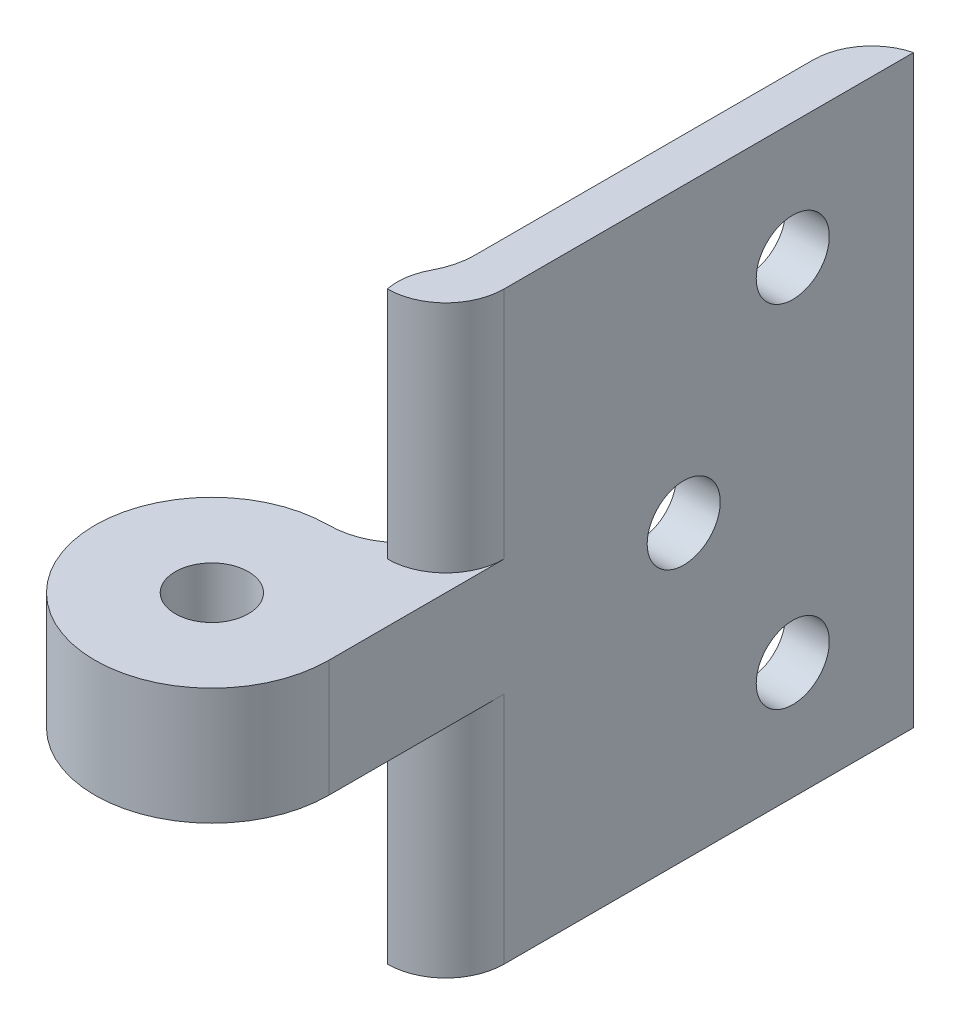
ISO-10303-21;
HEADER;
FILE_DESCRIPTION(('STEP AP214'),'2;1');
FILE_NAME('part.step','',(''),(''),'','','');
FILE_SCHEMA(('AUTOMOTIVE_DESIGN { 1 0 10303 214 1 1 1 1 }'));
ENDSEC;
DATA;
#1=APPLICATION_CONTEXT('core data for automotive mechanical design processes');
#2=APPLICATION_PROTOCOL_DEFINITION('international standard','automotive_design',2000,#1);
#3=PRODUCT_CONTEXT('',#1,'mechanical');
#4=PRODUCT('Part','Part','',(#3));
#5=PRODUCT_RELATED_PRODUCT_CATEGORY('part','',(#4));
#6=PRODUCT_DEFINITION_FORMATION('','',#4);
#7=PRODUCT_DEFINITION_CONTEXT('part definition',#1,'design');
#8=PRODUCT_DEFINITION('design','',#6,#7);
#9=PRODUCT_DEFINITION_SHAPE('','',#8);
#10=(LENGTH_UNIT() NAMED_UNIT(*) SI_UNIT(.MILLI.,.METRE.));
#11=(NAMED_UNIT(*) PLANE_ANGLE_UNIT() SI_UNIT($,.RADIAN.));
#12=(NAMED_UNIT(*) SI_UNIT($,.STERADIAN.) SOLID_ANGLE_UNIT());
#13=UNCERTAINTY_MEASURE_WITH_UNIT(LENGTH_MEASURE(1.E-05),#10,'distance_accuracy_value','');
#14=(GEOMETRIC_REPRESENTATION_CONTEXT(3) GLOBAL_UNCERTAINTY_ASSIGNED_CONTEXT((#13)) GLOBAL_UNIT_ASSIGNED_CONTEXT((#10,
#11,#12)) REPRESENTATION_CONTEXT('',''));
#15=CARTESIAN_POINT('',(0.,0.,0.));
#16=DIRECTION('',(0.,0.,1.));
#17=DIRECTION('',(1.,0.,0.));
#18=AXIS2_PLACEMENT_3D('',#15,#16,#17);
#19=CARTESIAN_POINT('',(0.,20.,0.));
#20=DIRECTION('',(0.,1.,0.));
#21=DIRECTION('',(0.,0.,1.));
#22=AXIS2_PLACEMENT_3D('',#19,#20,#21);
#23=PLANE('',#22);
#24=DIRECTION('',(0.,0.,-1.));
#25=VECTOR('',#24,1.);
#26=CARTESIAN_POINT('',(4.,20.,0.));
#27=LINE('',#26,#25);
#28=CARTESIAN_POINT('',(4.,20.,-6.));
#29=VERTEX_POINT('',#28);
#30=CARTESIAN_POINT('',(4.,20.,-20.));
#31=VERTEX_POINT('',#30);
#32=EDGE_CURVE('E222',#29,#31,#27,.T.);
#33=ORIENTED_EDGE('',*,*,#32,.T.);
#34=CARTESIAN_POINT('',(4.5,20.,-18.0635083268963));
#35=DIRECTION('',(0.,1.,0.));
#36=DIRECTION('',(0.,0.,1.));
#37=AXIS2_PLACEMENT_3D('',#34,#35,#36);
#38=CIRCLE('',#37,2.);
#39=CARTESIAN_POINT('',(2.5,20.,-18.0635083268963));
#40=VERTEX_POINT('',#39);
#41=EDGE_CURVE('E11',#31,#40,#38,.T.);
#42=ORIENTED_EDGE('',*,*,#41,.T.);
#43=DIRECTION('',(0.,0.,1.));
#44=VECTOR('',#43,1.);
#45=CARTESIAN_POINT('',(2.5,20.,-15.1200276625702));
#46=LINE('',#45,#44);
#47=CARTESIAN_POINT('',(2.5,20.,-6.5));
#48=VERTEX_POINT('',#47);
#49=EDGE_CURVE('E218',#40,#48,#46,.T.);
#50=ORIENTED_EDGE('',*,*,#49,.T.);
#51=CARTESIAN_POINT('',(0.,20.,-6.5));
#52=DIRECTION('',(0.,-1.,0.));
#53=DIRECTION('',(0.,0.,-1.));
#54=AXIS2_PLACEMENT_3D('',#51,#52,#53);
#55=CIRCLE('',#54,2.5);
#56=CARTESIAN_POINT('',(2.20282577906401,20.,-5.31781617880676));
#57=VERTEX_POINT('',#56);
#58=EDGE_CURVE('E221',#48,#57,#55,.T.);
#59=ORIENTED_EDGE('',*,*,#58,.T.);
#60=CARTESIAN_POINT('',(3.96508640231522,20.,-4.37206912185217));
#61=DIRECTION('',(0.,1.,0.));
#62=DIRECTION('',(0.,0.,1.));
#63=AXIS2_PLACEMENT_3D('',#60,#61,#62);
#64=CIRCLE('',#63,2.);
#65=CARTESIAN_POINT('',(2.,20.,-4.));
#66=VERTEX_POINT('',#65);
#67=EDGE_CURVE('E178',#57,#66,#64,.T.);
#68=ORIENTED_EDGE('',*,*,#67,.T.);
#69=CARTESIAN_POINT('',(2.,20.,-6.));
#70=DIRECTION('',(0.,1.,0.));
#71=DIRECTION('',(0.,0.,1.));
#72=AXIS2_PLACEMENT_3D('',#69,#70,#71);
#73=CIRCLE('',#72,2.);
#74=EDGE_CURVE('E150',#66,#29,#73,.T.);
#75=ORIENTED_EDGE('',*,*,#74,.T.);
#76=EDGE_LOOP('',(#33,#42,#50,#59,#68,#75));
#77=FACE_BOUND('',#76,.T.);
#78=ADVANCED_FACE('F37',(#77),#23,.T.);
#79=CARTESIAN_POINT('',(0.,0.,0.));
#80=DIRECTION('',(0.,1.,0.));
#81=DIRECTION('',(0.,0.,1.));
#82=AXIS2_PLACEMENT_3D('',#79,#80,#81);
#83=PLANE('',#82);
#84=DIRECTION('',(0.,0.,1.));
#85=VECTOR('',#84,1.);
#86=CARTESIAN_POINT('',(2.5,0.,-6.5));
#87=LINE('',#86,#85);
#88=CARTESIAN_POINT('',(2.5,0.,-18.0635083268963));
#89=VERTEX_POINT('',#88);
#90=CARTESIAN_POINT('',(2.5,0.,-6.5));
#91=VERTEX_POINT('',#90);
#92=EDGE_CURVE('E210',#89,#91,#87,.T.);
#93=ORIENTED_EDGE('',*,*,#92,.F.);
#94=CARTESIAN_POINT('',(4.5,0.,-18.0635083268963));
#95=DIRECTION('',(0.,1.,0.));
#96=DIRECTION('',(0.,0.,1.));
#97=AXIS2_PLACEMENT_3D('',#94,#95,#96);
#98=CIRCLE('',#97,2.);
#99=CARTESIAN_POINT('',(4.,0.,-20.));
#100=VERTEX_POINT('',#99);
#101=EDGE_CURVE('E45',#89,#100,#98,.F.);
#102=ORIENTED_EDGE('',*,*,#101,.T.);
#103=DIRECTION('',(0.,0.,-1.));
#104=VECTOR('',#103,1.);
#105=CARTESIAN_POINT('',(4.,0.,0.));
#106=LINE('',#105,#104);
#107=CARTESIAN_POINT('',(4.,0.,-6.));
#108=VERTEX_POINT('',#107);
#109=EDGE_CURVE('E166',#108,#100,#106,.T.);
#110=ORIENTED_EDGE('',*,*,#109,.F.);
#111=CARTESIAN_POINT('',(2.,0.,-6.));
#112=DIRECTION('',(0.,1.,0.));
#113=DIRECTION('',(0.,0.,1.));
#114=AXIS2_PLACEMENT_3D('',#111,#112,#113);
#115=CIRCLE('',#114,2.);
#116=CARTESIAN_POINT('',(2.,0.,-4.));
#117=VERTEX_POINT('',#116);
#118=EDGE_CURVE('E187',#108,#117,#115,.F.);
#119=ORIENTED_EDGE('',*,*,#118,.T.);
#120=CARTESIAN_POINT('',(3.96508640231522,0.,-4.37206912185217));
#121=DIRECTION('',(0.,1.,0.));
#122=DIRECTION('',(0.,0.,1.));
#123=AXIS2_PLACEMENT_3D('',#120,#121,#122);
#124=CIRCLE('',#123,2.);
#125=CARTESIAN_POINT('',(2.20282577906401,0.,-5.31781617880676));
#126=VERTEX_POINT('',#125);
#127=EDGE_CURVE('E193',#117,#126,#124,.F.);
#128=ORIENTED_EDGE('',*,*,#127,.T.);
#129=CARTESIAN_POINT('',(0.,0.,-6.5));
#130=DIRECTION('',(0.,-1.,0.));
#131=DIRECTION('',(0.,0.,-1.));
#132=AXIS2_PLACEMENT_3D('',#129,#130,#131);
#133=CIRCLE('',#132,2.5);
#134=EDGE_CURVE('E226',#91,#126,#133,.T.);
#135=ORIENTED_EDGE('',*,*,#134,.F.);
#136=EDGE_LOOP('',(#93,#102,#110,#119,#128,#135));
#137=FACE_BOUND('',#136,.T.);
#138=ADVANCED_FACE('F207',(#137),#83,.F.);
#139=CARTESIAN_POINT('',(0.,20.,0.));
#140=DIRECTION('',(0.,-1.,0.));
#141=DIRECTION('',(0.,0.,-1.));
#142=AXIS2_PLACEMENT_3D('',#139,#140,#141);
#143=CYLINDRICAL_SURFACE('',#142,4.);
#144=DIRECTION('',(0.,-1.,0.));
#145=VECTOR('',#144,1.);
#146=CARTESIAN_POINT('',(0.,20.,-4.));
#147=LINE('',#146,#145);
#148=CARTESIAN_POINT('',(0.,12.,-4.));
#149=VERTEX_POINT('',#148);
#150=CARTESIAN_POINT('',(0.,8.,-4.));
#151=VERTEX_POINT('',#150);
#152=EDGE_CURVE('E224',#149,#151,#147,.T.);
#153=ORIENTED_EDGE('',*,*,#152,.T.);
#154=CARTESIAN_POINT('',(0.,8.,0.));
#155=DIRECTION('',(0.,1.,0.));
#156=DIRECTION('',(0.,0.,1.));
#157=AXIS2_PLACEMENT_3D('',#154,#155,#156);
#158=CIRCLE('',#157,4.);
#159=CARTESIAN_POINT('',(4.,8.,0.));
#160=VERTEX_POINT('',#159);
#161=EDGE_CURVE('E144',#151,#160,#158,.T.);
#162=ORIENTED_EDGE('',*,*,#161,.T.);
#163=DIRECTION('',(0.,-1.,0.));
#164=VECTOR('',#163,1.);
#165=CARTESIAN_POINT('',(4.,20.,0.));
#166=LINE('',#165,#164);
#167=CARTESIAN_POINT('',(4.,12.,0.));
#168=VERTEX_POINT('',#167);
#169=EDGE_CURVE('E135',#168,#160,#166,.T.);
#170=ORIENTED_EDGE('',*,*,#169,.F.);
#171=CARTESIAN_POINT('',(0.,12.,0.));
#172=DIRECTION('',(0.,-1.,0.));
#173=DIRECTION('',(0.,0.,-1.));
#174=AXIS2_PLACEMENT_3D('',#171,#172,#173);
#175=CIRCLE('',#174,4.);
#176=EDGE_CURVE('E117',#168,#149,#175,.T.);
#177=ORIENTED_EDGE('',*,*,#176,.T.);
#178=EDGE_LOOP('',(#153,#162,#170,#177));
#179=FACE_BOUND('',#178,.T.);
#180=ADVANCED_FACE('F142',(#179),#143,.T.);
#181=CARTESIAN_POINT('',(4.,20.,0.));
#182=DIRECTION('',(-1.,0.,0.));
#183=DIRECTION('',(0.,0.,1.));
#184=AXIS2_PLACEMENT_3D('',#181,#182,#183);
#185=PLANE('',#184);
#186=CARTESIAN_POINT('',(4.,10.,-12.1392364547432));
#187=DIRECTION('',(-1.,0.,0.));
#188=DIRECTION('',(0.,0.,1.));
#189=AXIS2_PLACEMENT_3D('',#186,#187,#188);
#190=CIRCLE('',#189,1.25);
#191=CARTESIAN_POINT('',(4.,10.,-10.8892364547432));
#192=VERTEX_POINT('',#191);
#193=EDGE_CURVE('E160',#192,#192,#190,.T.);
#194=ORIENTED_EDGE('',*,*,#193,.T.);
#195=EDGE_LOOP('',(#194));
#196=FACE_BOUND('',#195,.T.);
#197=CARTESIAN_POINT('',(4.,4.,-15.8687376200159));
#198=DIRECTION('',(-1.,0.,0.));
#199=DIRECTION('',(0.,0.,1.));
#200=AXIS2_PLACEMENT_3D('',#197,#198,#199);
#201=CIRCLE('',#200,1.25);
#202=CARTESIAN_POINT('',(4.,4.,-14.6187376200159));
#203=VERTEX_POINT('',#202);
#204=EDGE_CURVE('E245',#203,#203,#201,.T.);
#205=ORIENTED_EDGE('',*,*,#204,.T.);
#206=EDGE_LOOP('',(#205));
#207=FACE_BOUND('',#206,.T.);
#208=CARTESIAN_POINT('',(4.,16.,-15.8687376200159));
#209=DIRECTION('',(-1.,0.,0.));
#210=DIRECTION('',(0.,0.,1.));
#211=AXIS2_PLACEMENT_3D('',#208,#209,#210);
#212=CIRCLE('',#211,1.25);
#213=CARTESIAN_POINT('',(4.,16.,-14.6187376200159));
#214=VERTEX_POINT('',#213);
#215=EDGE_CURVE('E242',#214,#214,#212,.T.);
#216=ORIENTED_EDGE('',*,*,#215,.T.);
#217=EDGE_LOOP('',(#216));
#218=FACE_BOUND('',#217,.T.);
#219=DIRECTION('',(0.,0.,1.));
#220=VECTOR('',#219,1.);
#221=CARTESIAN_POINT('',(4.,8.,6.));
#222=LINE('',#221,#220);
#223=CARTESIAN_POINT('',(4.,8.,-6.));
#224=VERTEX_POINT('',#223);
#225=EDGE_CURVE('E140',#224,#160,#222,.T.);
#226=ORIENTED_EDGE('',*,*,#225,.F.);
#227=DIRECTION('',(0.,1.,0.));
#228=VECTOR('',#227,1.);
#229=CARTESIAN_POINT('',(4.,20.,-6.));
#230=LINE('',#229,#228);
#231=EDGE_CURVE('E185',#224,#108,#230,.F.);
#232=ORIENTED_EDGE('',*,*,#231,.T.);
#233=ORIENTED_EDGE('',*,*,#109,.T.);
#234=DIRECTION('',(0.,-1.,0.));
#235=VECTOR('',#234,1.);
#236=CARTESIAN_POINT('',(4.,20.,-20.));
#237=LINE('',#236,#235);
#238=EDGE_CURVE('E147',#31,#100,#237,.T.);
#239=ORIENTED_EDGE('',*,*,#238,.F.);
#240=ORIENTED_EDGE('',*,*,#32,.F.);
#241=DIRECTION('',(0.,1.,0.));
#242=VECTOR('',#241,1.);
#243=CARTESIAN_POINT('',(4.,20.,-6.));
#244=LINE('',#243,#242);
#245=CARTESIAN_POINT('',(4.,12.,-6.));
#246=VERTEX_POINT('',#245);
#247=EDGE_CURVE('E138',#29,#246,#244,.F.);
#248=ORIENTED_EDGE('',*,*,#247,.T.);
#249=DIRECTION('',(0.,0.,-1.));
#250=VECTOR('',#249,1.);
#251=CARTESIAN_POINT('',(4.,12.,-4.));
#252=LINE('',#251,#250);
#253=EDGE_CURVE('E121',#168,#246,#252,.T.);
#254=ORIENTED_EDGE('',*,*,#253,.F.);
#255=ORIENTED_EDGE('',*,*,#169,.T.);
#256=EDGE_LOOP('',(#226,#232,#233,#239,#240,#248,#254,#255));
#257=FACE_BOUND('',#256,.T.);
#258=ADVANCED_FACE('F134',(#196,#207,#218,#257),#185,.F.);
#259=CARTESIAN_POINT('',(2.5,20.,-6.5));
#260=DIRECTION('',(1.,0.,0.));
#261=DIRECTION('',(0.,0.,-1.));
#262=AXIS2_PLACEMENT_3D('',#259,#260,#261);
#263=PLANE('',#262);
#264=CARTESIAN_POINT('',(2.5,10.,-12.1392364547432));
#265=DIRECTION('',(1.,0.,0.));
#266=DIRECTION('',(0.,0.,-1.));
#267=AXIS2_PLACEMENT_3D('',#264,#265,#266);
#268=CIRCLE('',#267,1.25);
#269=CARTESIAN_POINT('',(2.5,10.,-13.3892364547432));
#270=VERTEX_POINT('',#269);
#271=EDGE_CURVE('E163',#270,#270,#268,.T.);
#272=ORIENTED_EDGE('',*,*,#271,.T.);
#273=EDGE_LOOP('',(#272));
#274=FACE_BOUND('',#273,.T.);
#275=CARTESIAN_POINT('',(2.5,4.,-15.8687376200159));
#276=DIRECTION('',(1.,0.,0.));
#277=DIRECTION('',(0.,0.,-1.));
#278=AXIS2_PLACEMENT_3D('',#275,#276,#277);
#279=CIRCLE('',#278,1.25);
#280=CARTESIAN_POINT('',(2.5,4.,-17.1187376200159));
#281=VERTEX_POINT('',#280);
#282=EDGE_CURVE('E159',#281,#281,#279,.T.);
#283=ORIENTED_EDGE('',*,*,#282,.T.);
#284=EDGE_LOOP('',(#283));
#285=FACE_BOUND('',#284,.T.);
#286=CARTESIAN_POINT('',(2.5,16.,-15.8687376200159));
#287=DIRECTION('',(1.,0.,0.));
#288=DIRECTION('',(0.,0.,-1.));
#289=AXIS2_PLACEMENT_3D('',#286,#287,#288);
#290=CIRCLE('',#289,1.25);
#291=CARTESIAN_POINT('',(2.5,16.,-17.1187376200159));
#292=VERTEX_POINT('',#291);
#293=EDGE_CURVE('E156',#292,#292,#290,.T.);
#294=ORIENTED_EDGE('',*,*,#293,.T.);
#295=EDGE_LOOP('',(#294));
#296=FACE_BOUND('',#295,.T.);
#297=ORIENTED_EDGE('',*,*,#49,.F.);
#298=DIRECTION('',(0.,-1.,0.));
#299=VECTOR('',#298,1.);
#300=CARTESIAN_POINT('',(2.5,20.,-18.0635083268963));
#301=LINE('',#300,#299);
#302=EDGE_CURVE('E202',#40,#89,#301,.T.);
#303=ORIENTED_EDGE('',*,*,#302,.T.);
#304=ORIENTED_EDGE('',*,*,#92,.T.);
#305=DIRECTION('',(0.,-1.,0.));
#306=VECTOR('',#305,1.);
#307=CARTESIAN_POINT('',(2.5,20.,-6.5));
#308=LINE('',#307,#306);
#309=EDGE_CURVE('E152',#48,#91,#308,.T.);
#310=ORIENTED_EDGE('',*,*,#309,.F.);
#311=EDGE_LOOP('',(#297,#303,#304,#310));
#312=FACE_BOUND('',#311,.T.);
#313=ADVANCED_FACE('F215',(#274,#285,#296,#312),#263,.F.);
#314=CARTESIAN_POINT('',(0.,20.,-6.5));
#315=DIRECTION('',(0.,-1.,0.));
#316=DIRECTION('',(0.,0.,-1.));
#317=AXIS2_PLACEMENT_3D('',#314,#315,#316);
#318=CYLINDRICAL_SURFACE('',#317,2.5);
#319=ORIENTED_EDGE('',*,*,#134,.T.);
#320=DIRECTION('',(0.,-1.,0.));
#321=VECTOR('',#320,1.);
#322=CARTESIAN_POINT('',(2.20282577906401,20.,-5.31781617880676));
#323=LINE('',#322,#321);
#324=CARTESIAN_POINT('',(2.20282577906401,8.,-5.31781617880676));
#325=VERTEX_POINT('',#324);
#326=EDGE_CURVE('E197',#126,#325,#323,.F.);
#327=ORIENTED_EDGE('',*,*,#326,.T.);
#328=CARTESIAN_POINT('',(0.,8.,-6.5));
#329=DIRECTION('',(0.,1.,0.));
#330=DIRECTION('',(0.,0.,1.));
#331=AXIS2_PLACEMENT_3D('',#328,#329,#330);
#332=CIRCLE('',#331,2.5);
#333=EDGE_CURVE('E195',#325,#151,#332,.F.);
#334=ORIENTED_EDGE('',*,*,#333,.T.);
#335=ORIENTED_EDGE('',*,*,#152,.F.);
#336=CARTESIAN_POINT('',(0.,12.,-6.5));
#337=DIRECTION('',(0.,-1.,0.));
#338=DIRECTION('',(0.,0.,-1.));
#339=AXIS2_PLACEMENT_3D('',#336,#337,#338);
#340=CIRCLE('',#339,2.5);
#341=CARTESIAN_POINT('',(2.20282577906401,12.,-5.31781617880676));
#342=VERTEX_POINT('',#341);
#343=EDGE_CURVE('E124',#149,#342,#340,.F.);
#344=ORIENTED_EDGE('',*,*,#343,.T.);
#345=DIRECTION('',(0.,-1.,0.));
#346=VECTOR('',#345,1.);
#347=CARTESIAN_POINT('',(2.20282577906401,20.,-5.31781617880676));
#348=LINE('',#347,#346);
#349=EDGE_CURVE('E175',#342,#57,#348,.F.);
#350=ORIENTED_EDGE('',*,*,#349,.T.);
#351=ORIENTED_EDGE('',*,*,#58,.F.);
#352=ORIENTED_EDGE('',*,*,#309,.T.);
#353=EDGE_LOOP('',(#319,#327,#334,#335,#344,#350,#351,#352));
#354=FACE_BOUND('',#353,.T.);
#355=ADVANCED_FACE('F234',(#354),#318,.F.);
#356=CARTESIAN_POINT('',(4.,16.,-15.8687376200159));
#357=DIRECTION('',(-1.,0.,0.));
#358=DIRECTION('',(0.,0.,1.));
#359=AXIS2_PLACEMENT_3D('',#356,#357,#358);
#360=CYLINDRICAL_SURFACE('',#359,1.25);
#361=ORIENTED_EDGE('',*,*,#215,.F.);
#362=EDGE_LOOP('',(#361));
#363=FACE_BOUND('',#362,.T.);
#364=ORIENTED_EDGE('',*,*,#293,.F.);
#365=EDGE_LOOP('',(#364));
#366=FACE_BOUND('',#365,.T.);
#367=ADVANCED_FACE('F258',(#363,#366),#360,.F.);
#368=CARTESIAN_POINT('',(4.,4.,-15.8687376200159));
#369=DIRECTION('',(-1.,0.,0.));
#370=DIRECTION('',(0.,0.,1.));
#371=AXIS2_PLACEMENT_3D('',#368,#369,#370);
#372=CYLINDRICAL_SURFACE('',#371,1.25);
#373=ORIENTED_EDGE('',*,*,#204,.F.);
#374=EDGE_LOOP('',(#373));
#375=FACE_BOUND('',#374,.T.);
#376=ORIENTED_EDGE('',*,*,#282,.F.);
#377=EDGE_LOOP('',(#376));
#378=FACE_BOUND('',#377,.T.);
#379=ADVANCED_FACE('F254',(#375,#378),#372,.F.);
#380=CARTESIAN_POINT('',(4.,10.,-12.1392364547432));
#381=DIRECTION('',(-1.,0.,0.));
#382=DIRECTION('',(0.,0.,1.));
#383=AXIS2_PLACEMENT_3D('',#380,#381,#382);
#384=CYLINDRICAL_SURFACE('',#383,1.25);
#385=ORIENTED_EDGE('',*,*,#193,.F.);
#386=EDGE_LOOP('',(#385));
#387=FACE_BOUND('',#386,.T.);
#388=ORIENTED_EDGE('',*,*,#271,.F.);
#389=EDGE_LOOP('',(#388));
#390=FACE_BOUND('',#389,.T.);
#391=ADVANCED_FACE('F257',(#387,#390),#384,.F.);
#392=CARTESIAN_POINT('',(-4.,12.,-4.));
#393=DIRECTION('',(0.,-1.,0.));
#394=DIRECTION('',(0.,0.,-1.));
#395=AXIS2_PLACEMENT_3D('',#392,#393,#394);
#396=PLANE('',#395);
#397=CARTESIAN_POINT('',(0.,12.,0.));
#398=DIRECTION('',(0.,-1.,0.));
#399=DIRECTION('',(0.,0.,-1.));
#400=AXIS2_PLACEMENT_3D('',#397,#398,#399);
#401=CIRCLE('',#400,1.25);
#402=CARTESIAN_POINT('',(0.,12.,-1.25));
#403=VERTEX_POINT('',#402);
#404=EDGE_CURVE('E130',#403,#403,#401,.T.);
#405=ORIENTED_EDGE('',*,*,#404,.T.);
#406=EDGE_LOOP('',(#405));
#407=FACE_BOUND('',#406,.T.);
#408=ORIENTED_EDGE('',*,*,#253,.T.);
#409=CARTESIAN_POINT('',(2.,12.,-6.));
#410=DIRECTION('',(0.,-1.,0.));
#411=DIRECTION('',(0.,0.,-1.));
#412=AXIS2_PLACEMENT_3D('',#409,#410,#411);
#413=CIRCLE('',#412,2.);
#414=CARTESIAN_POINT('',(2.,12.,-4.));
#415=VERTEX_POINT('',#414);
#416=EDGE_CURVE('E173',#246,#415,#413,.T.);
#417=ORIENTED_EDGE('',*,*,#416,.T.);
#418=CARTESIAN_POINT('',(3.96508640231522,12.,-4.37206912185217));
#419=DIRECTION('',(0.,-1.,0.));
#420=DIRECTION('',(0.,0.,-1.));
#421=AXIS2_PLACEMENT_3D('',#418,#419,#420);
#422=CIRCLE('',#421,2.);
#423=EDGE_CURVE('E180',#415,#342,#422,.T.);
#424=ORIENTED_EDGE('',*,*,#423,.T.);
#425=ORIENTED_EDGE('',*,*,#343,.F.);
#426=ORIENTED_EDGE('',*,*,#176,.F.);
#427=EDGE_LOOP('',(#408,#417,#424,#425,#426));
#428=FACE_BOUND('',#427,.T.);
#429=ADVANCED_FACE('F119',(#407,#428),#396,.F.);
#430=CARTESIAN_POINT('',(-4.,8.,6.));
#431=DIRECTION('',(0.,1.,0.));
#432=DIRECTION('',(0.,0.,1.));
#433=AXIS2_PLACEMENT_3D('',#430,#431,#432);
#434=PLANE('',#433);
#435=CARTESIAN_POINT('',(0.,8.,0.));
#436=DIRECTION('',(0.,1.,0.));
#437=DIRECTION('',(0.,0.,1.));
#438=AXIS2_PLACEMENT_3D('',#435,#436,#437);
#439=CIRCLE('',#438,1.25);
#440=CARTESIAN_POINT('',(0.,8.,1.25));
#441=VERTEX_POINT('',#440);
#442=EDGE_CURVE('E129',#441,#441,#439,.T.);
#443=ORIENTED_EDGE('',*,*,#442,.T.);
#444=EDGE_LOOP('',(#443));
#445=FACE_BOUND('',#444,.T.);
#446=ORIENTED_EDGE('',*,*,#161,.F.);
#447=ORIENTED_EDGE('',*,*,#333,.F.);
#448=CARTESIAN_POINT('',(3.96508640231522,8.,-4.37206912185217));
#449=DIRECTION('',(0.,1.,0.));
#450=DIRECTION('',(0.,0.,1.));
#451=AXIS2_PLACEMENT_3D('',#448,#449,#450);
#452=CIRCLE('',#451,2.);
#453=CARTESIAN_POINT('',(2.,8.,-4.));
#454=VERTEX_POINT('',#453);
#455=EDGE_CURVE('E200',#325,#454,#452,.T.);
#456=ORIENTED_EDGE('',*,*,#455,.T.);
#457=CARTESIAN_POINT('',(2.,8.,-6.));
#458=DIRECTION('',(0.,1.,0.));
#459=DIRECTION('',(0.,0.,1.));
#460=AXIS2_PLACEMENT_3D('',#457,#458,#459);
#461=CIRCLE('',#460,2.);
#462=EDGE_CURVE('E190',#454,#224,#461,.T.);
#463=ORIENTED_EDGE('',*,*,#462,.T.);
#464=ORIENTED_EDGE('',*,*,#225,.T.);
#465=EDGE_LOOP('',(#446,#447,#456,#463,#464));
#466=FACE_BOUND('',#465,.T.);
#467=ADVANCED_FACE('F241',(#445,#466),#434,.F.);
#468=CARTESIAN_POINT('',(0.,20.,0.));
#469=DIRECTION('',(0.,-1.,0.));
#470=DIRECTION('',(0.,0.,-1.));
#471=AXIS2_PLACEMENT_3D('',#468,#469,#470);
#472=CYLINDRICAL_SURFACE('',#471,1.25);
#473=ORIENTED_EDGE('',*,*,#442,.F.);
#474=EDGE_LOOP('',(#473));
#475=FACE_BOUND('',#474,.T.);
#476=ORIENTED_EDGE('',*,*,#404,.F.);
#477=EDGE_LOOP('',(#476));
#478=FACE_BOUND('',#477,.T.);
#479=ADVANCED_FACE('F285',(#475,#478),#472,.F.);
#480=CARTESIAN_POINT('',(2.,12.,-6.));
#481=DIRECTION('',(0.,1.,0.));
#482=DIRECTION('',(0.,0.,1.));
#483=AXIS2_PLACEMENT_3D('',#480,#481,#482);
#484=CYLINDRICAL_SURFACE('',#483,2.);
#485=ORIENTED_EDGE('',*,*,#416,.F.);
#486=ORIENTED_EDGE('',*,*,#247,.F.);
#487=ORIENTED_EDGE('',*,*,#74,.F.);
#488=DIRECTION('',(0.,1.,0.));
#489=VECTOR('',#488,1.);
#490=CARTESIAN_POINT('',(2.,12.,-4.));
#491=LINE('',#490,#489);
#492=EDGE_CURVE('E146',#415,#66,#491,.T.);
#493=ORIENTED_EDGE('',*,*,#492,.F.);
#494=EDGE_LOOP('',(#485,#486,#487,#493));
#495=FACE_BOUND('',#494,.T.);
#496=ADVANCED_FACE('F292',(#495),#484,.T.);
#497=CARTESIAN_POINT('',(3.96508640231522,20.,-4.37206912185217));
#498=DIRECTION('',(0.,-1.,0.));
#499=DIRECTION('',(0.,0.,-1.));
#500=AXIS2_PLACEMENT_3D('',#497,#498,#499);
#501=CYLINDRICAL_SURFACE('',#500,2.);
#502=ORIENTED_EDGE('',*,*,#67,.F.);
#503=ORIENTED_EDGE('',*,*,#349,.F.);
#504=ORIENTED_EDGE('',*,*,#423,.F.);
#505=ORIENTED_EDGE('',*,*,#492,.T.);
#506=EDGE_LOOP('',(#502,#503,#504,#505));
#507=FACE_BOUND('',#506,.T.);
#508=ADVANCED_FACE('F295',(#507),#501,.T.);
#509=CARTESIAN_POINT('',(2.,0.,-6.));
#510=DIRECTION('',(0.,1.,0.));
#511=DIRECTION('',(0.,0.,1.));
#512=AXIS2_PLACEMENT_3D('',#509,#510,#511);
#513=CYLINDRICAL_SURFACE('',#512,2.);
#514=ORIENTED_EDGE('',*,*,#118,.F.);
#515=ORIENTED_EDGE('',*,*,#231,.F.);
#516=ORIENTED_EDGE('',*,*,#462,.F.);
#517=DIRECTION('',(0.,1.,0.));
#518=VECTOR('',#517,1.);
#519=CARTESIAN_POINT('',(2.,0.,-4.));
#520=LINE('',#519,#518);
#521=EDGE_CURVE('E182',#117,#454,#520,.T.);
#522=ORIENTED_EDGE('',*,*,#521,.F.);
#523=EDGE_LOOP('',(#514,#515,#516,#522));
#524=FACE_BOUND('',#523,.T.);
#525=ADVANCED_FACE('F299',(#524),#513,.T.);
#526=CARTESIAN_POINT('',(3.96508640231522,20.,-4.37206912185217));
#527=DIRECTION('',(0.,-1.,0.));
#528=DIRECTION('',(0.,0.,-1.));
#529=AXIS2_PLACEMENT_3D('',#526,#527,#528);
#530=CYLINDRICAL_SURFACE('',#529,2.);
#531=ORIENTED_EDGE('',*,*,#455,.F.);
#532=ORIENTED_EDGE('',*,*,#326,.F.);
#533=ORIENTED_EDGE('',*,*,#127,.F.);
#534=ORIENTED_EDGE('',*,*,#521,.T.);
#535=EDGE_LOOP('',(#531,#532,#533,#534));
#536=FACE_BOUND('',#535,.T.);
#537=ADVANCED_FACE('F239',(#536),#530,.T.);
#538=CARTESIAN_POINT('',(4.5,20.,-18.0635083268963));
#539=DIRECTION('',(0.,-1.,0.));
#540=DIRECTION('',(0.,0.,-1.));
#541=AXIS2_PLACEMENT_3D('',#538,#539,#540);
#542=CYLINDRICAL_SURFACE('',#541,2.);
#543=ORIENTED_EDGE('',*,*,#41,.F.);
#544=ORIENTED_EDGE('',*,*,#238,.T.);
#545=ORIENTED_EDGE('',*,*,#101,.F.);
#546=ORIENTED_EDGE('',*,*,#302,.F.);
#547=EDGE_LOOP('',(#543,#544,#545,#546));
#548=FACE_BOUND('',#547,.T.);
#549=ADVANCED_FACE('F39',(#548),#542,.T.);
#550=CLOSED_SHELL('',(#78,#138,#180,#258,#313,#355,#367,#379,#391,#429,#467,#479,#496,#508,#525,
#537,#549));
#551=MANIFOLD_SOLID_BREP('B2',#550);
#552=ADVANCED_BREP_SHAPE_REPRESENTATION('',(#18,#551),#14);
#553=SHAPE_DEFINITION_REPRESENTATION(#9,#552);
ENDSEC;
END-ISO-10303-21;
